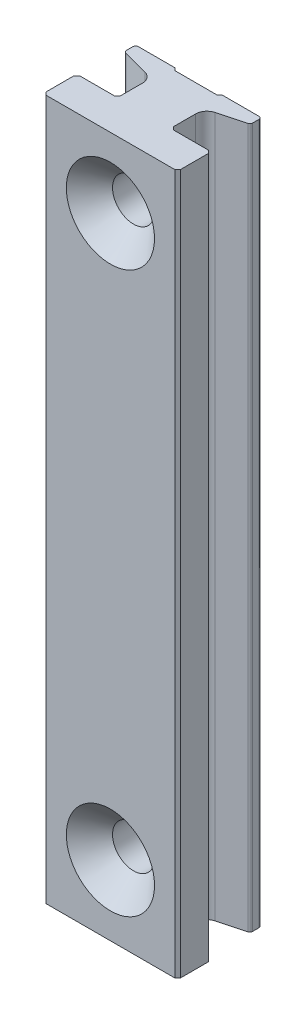
ISO-10303-21;
HEADER;
FILE_DESCRIPTION(('STEP AP214'),'2;1');
FILE_NAME('part.step','',(''),(''),'','','');
FILE_SCHEMA(('AUTOMOTIVE_DESIGN { 1 0 10303 214 1 1 1 1 }'));
ENDSEC;
DATA;
#1=APPLICATION_CONTEXT('core data for automotive mechanical design processes');
#2=APPLICATION_PROTOCOL_DEFINITION('international standard','automotive_design',2000,#1);
#3=PRODUCT_CONTEXT('',#1,'mechanical');
#4=PRODUCT('Part','Part','',(#3));
#5=PRODUCT_RELATED_PRODUCT_CATEGORY('part','',(#4));
#6=PRODUCT_DEFINITION_FORMATION('','',#4);
#7=PRODUCT_DEFINITION_CONTEXT('part definition',#1,'design');
#8=PRODUCT_DEFINITION('design','',#6,#7);
#9=PRODUCT_DEFINITION_SHAPE('','',#8);
#10=(LENGTH_UNIT() NAMED_UNIT(*) SI_UNIT(.MILLI.,.METRE.));
#11=(NAMED_UNIT(*) PLANE_ANGLE_UNIT() SI_UNIT($,.RADIAN.));
#12=(NAMED_UNIT(*) SI_UNIT($,.STERADIAN.) SOLID_ANGLE_UNIT());
#13=UNCERTAINTY_MEASURE_WITH_UNIT(LENGTH_MEASURE(1.E-05),#10,'distance_accuracy_value','');
#14=(GEOMETRIC_REPRESENTATION_CONTEXT(3) GLOBAL_UNCERTAINTY_ASSIGNED_CONTEXT((#13)) GLOBAL_UNIT_ASSIGNED_CONTEXT((#10,
#11,#12)) REPRESENTATION_CONTEXT('',''));
#15=CARTESIAN_POINT('',(0.,0.,0.));
#16=DIRECTION('',(0.,0.,1.));
#17=DIRECTION('',(1.,0.,0.));
#18=AXIS2_PLACEMENT_3D('',#15,#16,#17);
#19=CARTESIAN_POINT('',(0.,0.,0.));
#20=DIRECTION('',(0.,0.,1.));
#21=DIRECTION('',(1.,0.,0.));
#22=AXIS2_PLACEMENT_3D('',#19,#20,#21);
#23=PLANE('',#22);
#24=DIRECTION('',(1.,0.,0.));
#25=VECTOR('',#24,1.);
#26=CARTESIAN_POINT('',(-4.5,-25.,0.));
#27=LINE('',#26,#25);
#28=CARTESIAN_POINT('',(-4.30000000000001,-25.,0.));
#29=VERTEX_POINT('',#28);
#30=CARTESIAN_POINT('',(-1.7,-25.,0.));
#31=VERTEX_POINT('',#30);
#32=EDGE_CURVE('E440',#29,#31,#27,.T.);
#33=ORIENTED_EDGE('',*,*,#32,.F.);
#34=DIRECTION('',(0.,-1.,0.));
#35=VECTOR('',#34,1.);
#36=CARTESIAN_POINT('',(-4.3,25.,0.));
#37=LINE('',#36,#35);
#38=CARTESIAN_POINT('',(-4.3,25.,0.));
#39=VERTEX_POINT('',#38);
#40=EDGE_CURVE('E354',#29,#39,#37,.F.);
#41=ORIENTED_EDGE('',*,*,#40,.T.);
#42=DIRECTION('',(-1.,0.,0.));
#43=VECTOR('',#42,1.);
#44=CARTESIAN_POINT('',(4.5,25.,0.));
#45=LINE('',#44,#43);
#46=CARTESIAN_POINT('',(-1.7,25.,0.));
#47=VERTEX_POINT('',#46);
#48=EDGE_CURVE('E439',#47,#39,#45,.T.);
#49=ORIENTED_EDGE('',*,*,#48,.F.);
#50=DIRECTION('',(0.,1.,0.));
#51=VECTOR('',#50,1.);
#52=CARTESIAN_POINT('',(-1.7,0.,0.));
#53=LINE('',#52,#51);
#54=EDGE_CURVE('E238',#47,#31,#53,.F.);
#55=ORIENTED_EDGE('',*,*,#54,.T.);
#56=EDGE_LOOP('',(#33,#41,#49,#55));
#57=FACE_BOUND('',#56,.T.);
#58=ADVANCED_FACE('F34',(#57),#23,.F.);
#59=CARTESIAN_POINT('',(1.9,-25.,1.49666789853823));
#60=DIRECTION('',(-1.,0.,0.));
#61=DIRECTION('',(0.,0.,1.));
#62=AXIS2_PLACEMENT_3D('',#59,#60,#61);
#63=PLANE('',#62);
#64=DIRECTION('',(0.,0.,1.));
#65=VECTOR('',#64,1.);
#66=CARTESIAN_POINT('',(1.9,-25.,1.49666789853823));
#67=LINE('',#66,#65);
#68=CARTESIAN_POINT('',(1.9,-25.,2.11052948999519));
#69=VERTEX_POINT('',#68);
#70=CARTESIAN_POINT('',(1.9,-25.,3.69999999999999));
#71=VERTEX_POINT('',#70);
#72=EDGE_CURVE('E374',#69,#71,#67,.T.);
#73=ORIENTED_EDGE('',*,*,#72,.F.);
#74=DIRECTION('',(0.,-1.,0.));
#75=VECTOR('',#74,1.);
#76=CARTESIAN_POINT('',(1.9,25.,2.11052948999519));
#77=LINE('',#76,#75);
#78=CARTESIAN_POINT('',(1.9,25.,2.11052948999519));
#79=VERTEX_POINT('',#78);
#80=EDGE_CURVE('E356',#69,#79,#77,.F.);
#81=ORIENTED_EDGE('',*,*,#80,.T.);
#82=DIRECTION('',(0.,0.,1.));
#83=VECTOR('',#82,1.);
#84=CARTESIAN_POINT('',(1.9,25.,1.49666789853823));
#85=LINE('',#84,#83);
#86=CARTESIAN_POINT('',(1.9,25.,3.69999999999999));
#87=VERTEX_POINT('',#86);
#88=EDGE_CURVE('E390',#79,#87,#85,.T.);
#89=ORIENTED_EDGE('',*,*,#88,.T.);
#90=DIRECTION('',(0.,-1.,0.));
#91=VECTOR('',#90,1.);
#92=CARTESIAN_POINT('',(1.9,-25.,3.69999999999999));
#93=LINE('',#92,#91);
#94=EDGE_CURVE('E306',#87,#71,#93,.T.);
#95=ORIENTED_EDGE('',*,*,#94,.T.);
#96=EDGE_LOOP('',(#73,#81,#89,#95));
#97=FACE_BOUND('',#96,.T.);
#98=ADVANCED_FACE('F381',(#97),#63,.F.);
#99=CARTESIAN_POINT('',(-1.9,-25.,6.3));
#100=DIRECTION('',(1.,0.,0.));
#101=DIRECTION('',(0.,0.,-1.));
#102=AXIS2_PLACEMENT_3D('',#99,#100,#101);
#103=PLANE('',#102);
#104=DIRECTION('',(0.,0.,-1.));
#105=VECTOR('',#104,1.);
#106=CARTESIAN_POINT('',(-1.9,25.,6.3));
#107=LINE('',#106,#105);
#108=CARTESIAN_POINT('',(-1.9,25.,3.7));
#109=VERTEX_POINT('',#108);
#110=CARTESIAN_POINT('',(-1.9,25.,2.1105294899952));
#111=VERTEX_POINT('',#110);
#112=EDGE_CURVE('E432',#109,#111,#107,.T.);
#113=ORIENTED_EDGE('',*,*,#112,.T.);
#114=DIRECTION('',(0.,-1.,0.));
#115=VECTOR('',#114,1.);
#116=CARTESIAN_POINT('',(-1.9,-25.,2.1105294899952));
#117=LINE('',#116,#115);
#118=CARTESIAN_POINT('',(-1.9,-25.,2.1105294899952));
#119=VERTEX_POINT('',#118);
#120=EDGE_CURVE('E55',#111,#119,#117,.T.);
#121=ORIENTED_EDGE('',*,*,#120,.T.);
#122=DIRECTION('',(0.,0.,-1.));
#123=VECTOR('',#122,1.);
#124=CARTESIAN_POINT('',(-1.9,-25.,6.3));
#125=LINE('',#124,#123);
#126=CARTESIAN_POINT('',(-1.9,-25.,3.7));
#127=VERTEX_POINT('',#126);
#128=EDGE_CURVE('E433',#127,#119,#125,.T.);
#129=ORIENTED_EDGE('',*,*,#128,.F.);
#130=DIRECTION('',(0.,1.,0.));
#131=VECTOR('',#130,1.);
#132=CARTESIAN_POINT('',(-1.9,25.,3.7));
#133=LINE('',#132,#131);
#134=EDGE_CURVE('E300',#127,#109,#133,.T.);
#135=ORIENTED_EDGE('',*,*,#134,.T.);
#136=EDGE_LOOP('',(#113,#121,#129,#135));
#137=FACE_BOUND('',#136,.T.);
#138=ADVANCED_FACE('F514',(#137),#103,.F.);
#139=CARTESIAN_POINT('',(4.5,-25.,0.));
#140=DIRECTION('',(1.,0.,0.));
#141=DIRECTION('',(0.,1.,0.));
#142=AXIS2_PLACEMENT_3D('',#139,#140,#141);
#143=PLANE('',#142);
#144=DIRECTION('',(0.,0.,1.));
#145=VECTOR('',#144,1.);
#146=CARTESIAN_POINT('',(4.5,25.,0.));
#147=LINE('',#146,#145);
#148=CARTESIAN_POINT('',(4.5,25.,0.199999999999998));
#149=VERTEX_POINT('',#148);
#150=CARTESIAN_POINT('',(4.5,25.,0.646534605004633));
#151=VERTEX_POINT('',#150);
#152=EDGE_CURVE('E442',#149,#151,#147,.T.);
#153=ORIENTED_EDGE('',*,*,#152,.T.);
#154=DIRECTION('',(0.,-1.,0.));
#155=VECTOR('',#154,1.);
#156=CARTESIAN_POINT('',(4.5,-25.,0.646534605004632));
#157=LINE('',#156,#155);
#158=CARTESIAN_POINT('',(4.5,-25.,0.646534605004632));
#159=VERTEX_POINT('',#158);
#160=EDGE_CURVE('E333',#151,#159,#157,.T.);
#161=ORIENTED_EDGE('',*,*,#160,.T.);
#162=DIRECTION('',(0.,0.,1.));
#163=VECTOR('',#162,1.);
#164=CARTESIAN_POINT('',(4.5,-25.,0.));
#165=LINE('',#164,#163);
#166=CARTESIAN_POINT('',(4.5,-25.,0.199999999999998));
#167=VERTEX_POINT('',#166);
#168=EDGE_CURVE('E265',#167,#159,#165,.T.);
#169=ORIENTED_EDGE('',*,*,#168,.F.);
#170=DIRECTION('',(0.,1.,0.));
#171=VECTOR('',#170,1.);
#172=CARTESIAN_POINT('',(4.5,25.,0.199999999999998));
#173=LINE('',#172,#171);
#174=EDGE_CURVE('E330',#167,#149,#173,.T.);
#175=ORIENTED_EDGE('',*,*,#174,.T.);
#176=EDGE_LOOP('',(#153,#161,#169,#175));
#177=FACE_BOUND('',#176,.T.);
#178=ADVANCED_FACE('F493',(#177),#143,.T.);
#179=CARTESIAN_POINT('',(-4.5,-25.,0.));
#180=DIRECTION('',(0.,-1.,0.));
#181=DIRECTION('',(0.,0.,-1.));
#182=AXIS2_PLACEMENT_3D('',#179,#180,#181);
#183=PLANE('',#182);
#184=ORIENTED_EDGE('',*,*,#168,.T.);
#185=CARTESIAN_POINT('',(4.30000000000001,-25.,0.646534605004632));
#186=DIRECTION('',(0.,-1.,0.));
#187=DIRECTION('',(0.,0.,-1.));
#188=AXIS2_PLACEMENT_3D('',#185,#186,#187);
#189=CIRCLE('',#188,0.199999999999999);
#190=CARTESIAN_POINT('',(4.35176380869828,-25.,0.839719770348785));
#191=VERTEX_POINT('',#190);
#192=EDGE_CURVE('E341',#159,#191,#189,.T.);
#193=ORIENTED_EDGE('',*,*,#192,.T.);
#194=DIRECTION('',(0.965925826720774,0.,-0.258819043491374));
#195=VECTOR('',#194,1.);
#196=CARTESIAN_POINT('',(1.9,-25.,1.49666789853823));
#197=LINE('',#196,#195);
#198=CARTESIAN_POINT('',(2.49294476522019,-25.,1.33778882860125));
#199=VERTEX_POINT('',#198);
#200=EDGE_CURVE('E376',#191,#199,#197,.F.);
#201=ORIENTED_EDGE('',*,*,#200,.T.);
#202=CARTESIAN_POINT('',(2.70000000001793,-25.,2.11052948999519));
#203=DIRECTION('',(0.,-1.,0.));
#204=DIRECTION('',(0.,0.,-1.));
#205=AXIS2_PLACEMENT_3D('',#202,#203,#204);
#206=CIRCLE('',#205,0.800000000017933);
#207=EDGE_CURVE('E367',#199,#69,#206,.F.);
#208=ORIENTED_EDGE('',*,*,#207,.T.);
#209=ORIENTED_EDGE('',*,*,#72,.T.);
#210=DIRECTION('',(-0.70710678118656,0.,-0.707106781186535));
#211=VECTOR('',#210,1.);
#212=CARTESIAN_POINT('',(2.10000000000002,-25.,3.9));
#213=LINE('',#212,#211);
#214=CARTESIAN_POINT('',(2.10000000000001,-25.,3.89999999999999));
#215=VERTEX_POINT('',#214);
#216=EDGE_CURVE('E316',#71,#215,#213,.F.);
#217=ORIENTED_EDGE('',*,*,#216,.T.);
#218=DIRECTION('',(-1.,0.,0.));
#219=VECTOR('',#218,1.);
#220=CARTESIAN_POINT('',(4.8,-25.,3.89999999999999));
#221=LINE('',#220,#219);
#222=CARTESIAN_POINT('',(4.60000000000001,-25.,3.9));
#223=VERTEX_POINT('',#222);
#224=EDGE_CURVE('E398',#223,#215,#221,.T.);
#225=ORIENTED_EDGE('',*,*,#224,.F.);
#226=DIRECTION('',(-0.707106781186548,0.,-0.707106781186548));
#227=VECTOR('',#226,1.);
#228=CARTESIAN_POINT('',(-1.9,-25.,-2.60000000000001));
#229=LINE('',#228,#227);
#230=CARTESIAN_POINT('',(4.8,-25.,4.09999999999999));
#231=VERTEX_POINT('',#230);
#232=EDGE_CURVE('E287',#223,#231,#229,.F.);
#233=ORIENTED_EDGE('',*,*,#232,.T.);
#234=DIRECTION('',(0.,0.,-1.));
#235=VECTOR('',#234,1.);
#236=CARTESIAN_POINT('',(4.8,-25.,3.89999999999999));
#237=LINE('',#236,#235);
#238=CARTESIAN_POINT('',(4.8,-25.,6.1));
#239=VERTEX_POINT('',#238);
#240=EDGE_CURVE('E416',#239,#231,#237,.T.);
#241=ORIENTED_EDGE('',*,*,#240,.F.);
#242=DIRECTION('',(-0.707106781186548,0.,0.707106781186548));
#243=VECTOR('',#242,1.);
#244=CARTESIAN_POINT('',(3.2,-25.,7.7));
#245=LINE('',#244,#243);
#246=CARTESIAN_POINT('',(4.6,-25.,6.3));
#247=VERTEX_POINT('',#246);
#248=EDGE_CURVE('E281',#239,#247,#245,.T.);
#249=ORIENTED_EDGE('',*,*,#248,.T.);
#250=DIRECTION('',(1.,0.,0.));
#251=VECTOR('',#250,1.);
#252=CARTESIAN_POINT('',(-4.5,-25.,6.3));
#253=LINE('',#252,#251);
#254=CARTESIAN_POINT('',(-4.6,-25.,6.3));
#255=VERTEX_POINT('',#254);
#256=EDGE_CURVE('E446',#255,#247,#253,.T.);
#257=ORIENTED_EDGE('',*,*,#256,.F.);
#258=DIRECTION('',(-0.707106781186548,0.,-0.707106781186548));
#259=VECTOR('',#258,1.);
#260=CARTESIAN_POINT('',(-7.7,-25.,3.2));
#261=LINE('',#260,#259);
#262=CARTESIAN_POINT('',(-4.8,-25.,6.1));
#263=VERTEX_POINT('',#262);
#264=EDGE_CURVE('E283',#255,#263,#261,.T.);
#265=ORIENTED_EDGE('',*,*,#264,.T.);
#266=DIRECTION('',(0.,0.,1.));
#267=VECTOR('',#266,1.);
#268=CARTESIAN_POINT('',(-4.8,-25.,6.30000000000001));
#269=LINE('',#268,#267);
#270=CARTESIAN_POINT('',(-4.8,-25.,4.09999999999999));
#271=VERTEX_POINT('',#270);
#272=EDGE_CURVE('E423',#271,#263,#269,.T.);
#273=ORIENTED_EDGE('',*,*,#272,.F.);
#274=DIRECTION('',(-0.707106781186547,0.,0.707106781186548));
#275=VECTOR('',#274,1.);
#276=CARTESIAN_POINT('',(-2.60000000000001,-25.,1.89999999999999));
#277=LINE('',#276,#275);
#278=CARTESIAN_POINT('',(-4.60000000000001,-25.,3.9));
#279=VERTEX_POINT('',#278);
#280=EDGE_CURVE('E285',#271,#279,#277,.F.);
#281=ORIENTED_EDGE('',*,*,#280,.T.);
#282=DIRECTION('',(1.,0.,0.));
#283=VECTOR('',#282,1.);
#284=CARTESIAN_POINT('',(-4.8,-25.,3.9));
#285=LINE('',#284,#283);
#286=CARTESIAN_POINT('',(-2.10000000000001,-25.,3.9));
#287=VERTEX_POINT('',#286);
#288=EDGE_CURVE('E426',#279,#287,#285,.T.);
#289=ORIENTED_EDGE('',*,*,#288,.T.);
#290=DIRECTION('',(-0.70710678118656,0.,0.707106781186535));
#291=VECTOR('',#290,1.);
#292=CARTESIAN_POINT('',(-2.10000000000001,-25.,3.9));
#293=LINE('',#292,#291);
#294=EDGE_CURVE('E309',#287,#127,#293,.F.);
#295=ORIENTED_EDGE('',*,*,#294,.T.);
#296=ORIENTED_EDGE('',*,*,#128,.T.);
#297=CARTESIAN_POINT('',(-2.70000000001793,-25.,2.1105294899952));
#298=DIRECTION('',(0.,-1.,0.));
#299=DIRECTION('',(0.,0.,-1.));
#300=AXIS2_PLACEMENT_3D('',#297,#298,#299);
#301=CIRCLE('',#300,0.800000000017933);
#302=CARTESIAN_POINT('',(-2.49294476522019,-25.,1.33778882860126));
#303=VERTEX_POINT('',#302);
#304=EDGE_CURVE('E11',#119,#303,#301,.F.);
#305=ORIENTED_EDGE('',*,*,#304,.T.);
#306=DIRECTION('',(0.965925826720774,0.,0.258819043491374));
#307=VECTOR('',#306,1.);
#308=CARTESIAN_POINT('',(-4.5,-25.,0.800000002865442));
#309=LINE('',#308,#307);
#310=CARTESIAN_POINT('',(-4.35176380869828,-25.,0.839719770348796));
#311=VERTEX_POINT('',#310);
#312=EDGE_CURVE('E402',#303,#311,#309,.F.);
#313=ORIENTED_EDGE('',*,*,#312,.T.);
#314=CARTESIAN_POINT('',(-4.30000000000001,-25.,0.646534605004642));
#315=DIRECTION('',(0.,-1.,0.));
#316=DIRECTION('',(0.,0.,-1.));
#317=AXIS2_PLACEMENT_3D('',#314,#315,#316);
#318=CIRCLE('',#317,0.199999999999999);
#319=CARTESIAN_POINT('',(-4.5,-25.,0.646534605004642));
#320=VERTEX_POINT('',#319);
#321=EDGE_CURVE('E337',#311,#320,#318,.T.);
#322=ORIENTED_EDGE('',*,*,#321,.T.);
#323=DIRECTION('',(0.,0.,1.));
#324=VECTOR('',#323,1.);
#325=CARTESIAN_POINT('',(-4.5,-25.,0.));
#326=LINE('',#325,#324);
#327=CARTESIAN_POINT('',(-4.5,-25.,0.199999999999998));
#328=VERTEX_POINT('',#327);
#329=EDGE_CURVE('E450',#328,#320,#326,.T.);
#330=ORIENTED_EDGE('',*,*,#329,.F.);
#331=CARTESIAN_POINT('',(-4.30000000000001,-25.,0.199999999999998));
#332=DIRECTION('',(0.,-1.,0.));
#333=DIRECTION('',(0.,0.,-1.));
#334=AXIS2_PLACEMENT_3D('',#331,#332,#333);
#335=CIRCLE('',#334,0.199999999999999);
#336=EDGE_CURVE('E335',#328,#29,#335,.T.);
#337=ORIENTED_EDGE('',*,*,#336,.T.);
#338=ORIENTED_EDGE('',*,*,#32,.T.);
#339=DIRECTION('',(0.707106781186549,0.,0.707106781186546));
#340=VECTOR('',#339,1.);
#341=CARTESIAN_POINT('',(-3.10000000000001,-25.,-1.4));
#342=LINE('',#341,#340);
#343=CARTESIAN_POINT('',(-1.52,-25.,0.18));
#344=VERTEX_POINT('',#343);
#345=EDGE_CURVE('E254',#344,#31,#342,.F.);
#346=ORIENTED_EDGE('',*,*,#345,.F.);
#347=DIRECTION('',(-1.,0.,0.));
#348=VECTOR('',#347,1.);
#349=CARTESIAN_POINT('',(1.52,-25.,0.18));
#350=LINE('',#349,#348);
#351=CARTESIAN_POINT('',(1.52,-25.,0.18));
#352=VERTEX_POINT('',#351);
#353=EDGE_CURVE('E246',#352,#344,#350,.T.);
#354=ORIENTED_EDGE('',*,*,#353,.F.);
#355=DIRECTION('',(0.707106781186549,0.,-0.707106781186546));
#356=VECTOR('',#355,1.);
#357=CARTESIAN_POINT('',(-1.40000000000002,-25.,3.1));
#358=LINE('',#357,#356);
#359=CARTESIAN_POINT('',(1.7,-25.,0.));
#360=VERTEX_POINT('',#359);
#361=EDGE_CURVE('E226',#360,#352,#358,.F.);
#362=ORIENTED_EDGE('',*,*,#361,.F.);
#363=CARTESIAN_POINT('',(4.30000000000001,-25.,0.));
#364=VERTEX_POINT('',#363);
#365=EDGE_CURVE('E438',#360,#364,#27,.T.);
#366=ORIENTED_EDGE('',*,*,#365,.T.);
#367=CARTESIAN_POINT('',(4.30000000000001,-25.,0.199999999999998));
#368=DIRECTION('',(0.,-1.,0.));
#369=DIRECTION('',(0.,0.,-1.));
#370=AXIS2_PLACEMENT_3D('',#367,#368,#369);
#371=CIRCLE('',#370,0.199999999999999);
#372=EDGE_CURVE('E339',#364,#167,#371,.T.);
#373=ORIENTED_EDGE('',*,*,#372,.T.);
#374=EDGE_LOOP('',(#184,#193,#201,#208,#209,#217,#225,#233,#241,#249,#257,#265,#273,#281,#289,
#295,#296,#305,#313,#322,#330,#337,#338,#346,#354,#362,#366,#373));
#375=FACE_BOUND('',#374,.T.);
#376=ADVANCED_FACE('F373',(#375),#183,.T.);
#377=CARTESIAN_POINT('',(-4.5,25.,0.));
#378=DIRECTION('',(-1.,0.,0.));
#379=DIRECTION('',(0.,-1.,0.));
#380=AXIS2_PLACEMENT_3D('',#377,#378,#379);
#381=PLANE('',#380);
#382=ORIENTED_EDGE('',*,*,#329,.T.);
#383=DIRECTION('',(0.,-1.,0.));
#384=VECTOR('',#383,1.);
#385=CARTESIAN_POINT('',(-4.5,25.,0.646534605004643));
#386=LINE('',#385,#384);
#387=CARTESIAN_POINT('',(-4.5,25.,0.646534605004643));
#388=VERTEX_POINT('',#387);
#389=EDGE_CURVE('E348',#320,#388,#386,.F.);
#390=ORIENTED_EDGE('',*,*,#389,.T.);
#391=DIRECTION('',(0.,0.,1.));
#392=VECTOR('',#391,1.);
#393=CARTESIAN_POINT('',(-4.5,25.,0.));
#394=LINE('',#393,#392);
#395=CARTESIAN_POINT('',(-4.5,25.,0.199999999999998));
#396=VERTEX_POINT('',#395);
#397=EDGE_CURVE('E453',#396,#388,#394,.T.);
#398=ORIENTED_EDGE('',*,*,#397,.F.);
#399=DIRECTION('',(0.,-1.,0.));
#400=VECTOR('',#399,1.);
#401=CARTESIAN_POINT('',(-4.5,-25.,0.199999999999998));
#402=LINE('',#401,#400);
#403=EDGE_CURVE('E345',#396,#328,#402,.T.);
#404=ORIENTED_EDGE('',*,*,#403,.T.);
#405=EDGE_LOOP('',(#382,#390,#398,#404));
#406=FACE_BOUND('',#405,.T.);
#407=ADVANCED_FACE('F469',(#406),#381,.T.);
#408=CARTESIAN_POINT('',(4.5,25.,0.));
#409=DIRECTION('',(0.,1.,0.));
#410=DIRECTION('',(0.,0.,1.));
#411=AXIS2_PLACEMENT_3D('',#408,#409,#410);
#412=PLANE('',#411);
#413=DIRECTION('',(0.965925826720774,0.,-0.258819043491374));
#414=VECTOR('',#413,1.);
#415=CARTESIAN_POINT('',(4.69999999956075,25.,0.746410164854452));
#416=LINE('',#415,#414);
#417=CARTESIAN_POINT('',(4.35176380869828,25.,0.839719770348786));
#418=VERTEX_POINT('',#417);
#419=CARTESIAN_POINT('',(2.49294476522019,25.,1.33778882860125));
#420=VERTEX_POINT('',#419);
#421=EDGE_CURVE('E389',#418,#420,#416,.F.);
#422=ORIENTED_EDGE('',*,*,#421,.F.);
#423=CARTESIAN_POINT('',(4.3,25.,0.646534605004633));
#424=DIRECTION('',(0.,1.,0.));
#425=DIRECTION('',(0.,0.,1.));
#426=AXIS2_PLACEMENT_3D('',#423,#424,#425);
#427=CIRCLE('',#426,0.199999999999999);
#428=EDGE_CURVE('E328',#418,#151,#427,.T.);
#429=ORIENTED_EDGE('',*,*,#428,.T.);
#430=ORIENTED_EDGE('',*,*,#152,.F.);
#431=CARTESIAN_POINT('',(4.3,25.,0.199999999999998));
#432=DIRECTION('',(0.,1.,0.));
#433=DIRECTION('',(0.,0.,1.));
#434=AXIS2_PLACEMENT_3D('',#431,#432,#433);
#435=CIRCLE('',#434,0.199999999999999);
#436=CARTESIAN_POINT('',(4.3,25.,0.));
#437=VERTEX_POINT('',#436);
#438=EDGE_CURVE('E326',#149,#437,#435,.T.);
#439=ORIENTED_EDGE('',*,*,#438,.T.);
#440=CARTESIAN_POINT('',(1.7,25.,0.));
#441=VERTEX_POINT('',#440);
#442=EDGE_CURVE('E243',#437,#441,#45,.T.);
#443=ORIENTED_EDGE('',*,*,#442,.T.);
#444=DIRECTION('',(0.707106781186549,0.,-0.707106781186546));
#445=VECTOR('',#444,1.);
#446=CARTESIAN_POINT('',(1.52,25.,0.18));
#447=LINE('',#446,#445);
#448=CARTESIAN_POINT('',(1.52,25.,0.18));
#449=VERTEX_POINT('',#448);
#450=EDGE_CURVE('E223',#441,#449,#447,.F.);
#451=ORIENTED_EDGE('',*,*,#450,.T.);
#452=DIRECTION('',(-1.,0.,0.));
#453=VECTOR('',#452,1.);
#454=CARTESIAN_POINT('',(1.52,25.,0.18));
#455=LINE('',#454,#453);
#456=CARTESIAN_POINT('',(-1.52,25.,0.18));
#457=VERTEX_POINT('',#456);
#458=EDGE_CURVE('E234',#449,#457,#455,.T.);
#459=ORIENTED_EDGE('',*,*,#458,.T.);
#460=DIRECTION('',(0.707106781186549,0.,0.707106781186546));
#461=VECTOR('',#460,1.);
#462=CARTESIAN_POINT('',(-1.52,25.,0.18));
#463=LINE('',#462,#461);
#464=EDGE_CURVE('E244',#457,#47,#463,.F.);
#465=ORIENTED_EDGE('',*,*,#464,.T.);
#466=ORIENTED_EDGE('',*,*,#48,.T.);
#467=CARTESIAN_POINT('',(-4.3,25.,0.199999999999998));
#468=DIRECTION('',(0.,1.,0.));
#469=DIRECTION('',(0.,0.,1.));
#470=AXIS2_PLACEMENT_3D('',#467,#468,#469);
#471=CIRCLE('',#470,0.199999999999999);
#472=EDGE_CURVE('E321',#39,#396,#471,.T.);
#473=ORIENTED_EDGE('',*,*,#472,.T.);
#474=ORIENTED_EDGE('',*,*,#397,.T.);
#475=CARTESIAN_POINT('',(-4.3,25.,0.646534605004643));
#476=DIRECTION('',(0.,1.,0.));
#477=DIRECTION('',(0.,0.,1.));
#478=AXIS2_PLACEMENT_3D('',#475,#476,#477);
#479=CIRCLE('',#478,0.199999999999999);
#480=CARTESIAN_POINT('',(-4.35176380869828,25.,0.839719770348797));
#481=VERTEX_POINT('',#480);
#482=EDGE_CURVE('E323',#388,#481,#479,.T.);
#483=ORIENTED_EDGE('',*,*,#482,.T.);
#484=DIRECTION('',(0.965925826720774,0.,0.258819043491374));
#485=VECTOR('',#484,1.);
#486=CARTESIAN_POINT('',(3.69711432497514,25.,2.99641015185383));
#487=LINE('',#486,#485);
#488=CARTESIAN_POINT('',(-2.49294476522019,25.,1.33778882860126));
#489=VERTEX_POINT('',#488);
#490=EDGE_CURVE('E435',#489,#481,#487,.F.);
#491=ORIENTED_EDGE('',*,*,#490,.F.);
#492=CARTESIAN_POINT('',(-2.70000000001793,25.,2.1105294899952));
#493=DIRECTION('',(0.,1.,0.));
#494=DIRECTION('',(0.,0.,1.));
#495=AXIS2_PLACEMENT_3D('',#492,#493,#494);
#496=CIRCLE('',#495,0.800000000017933);
#497=EDGE_CURVE('E42',#489,#111,#496,.F.);
#498=ORIENTED_EDGE('',*,*,#497,.T.);
#499=ORIENTED_EDGE('',*,*,#112,.F.);
#500=DIRECTION('',(0.70710678118656,0.,-0.707106781186535));
#501=VECTOR('',#500,1.);
#502=CARTESIAN_POINT('',(-2.10000000000001,25.,3.9));
#503=LINE('',#502,#501);
#504=CARTESIAN_POINT('',(-2.10000000000001,25.,3.9));
#505=VERTEX_POINT('',#504);
#506=EDGE_CURVE('E311',#109,#505,#503,.F.);
#507=ORIENTED_EDGE('',*,*,#506,.T.);
#508=DIRECTION('',(1.,0.,0.));
#509=VECTOR('',#508,1.);
#510=CARTESIAN_POINT('',(-4.8,25.,3.9));
#511=LINE('',#510,#509);
#512=CARTESIAN_POINT('',(-4.60000000000001,25.,3.9));
#513=VERTEX_POINT('',#512);
#514=EDGE_CURVE('E429',#513,#505,#511,.T.);
#515=ORIENTED_EDGE('',*,*,#514,.F.);
#516=DIRECTION('',(0.707106781186547,0.,-0.707106781186548));
#517=VECTOR('',#516,1.);
#518=CARTESIAN_POINT('',(1.89999999999999,25.,-2.60000000000001));
#519=LINE('',#518,#517);
#520=CARTESIAN_POINT('',(-4.8,25.,4.09999999999999));
#521=VERTEX_POINT('',#520);
#522=EDGE_CURVE('E272',#513,#521,#519,.F.);
#523=ORIENTED_EDGE('',*,*,#522,.T.);
#524=DIRECTION('',(0.,0.,-1.));
#525=VECTOR('',#524,1.);
#526=CARTESIAN_POINT('',(-4.8,25.,3.9));
#527=LINE('',#526,#525);
#528=CARTESIAN_POINT('',(-4.8,25.,6.1));
#529=VERTEX_POINT('',#528);
#530=EDGE_CURVE('E385',#529,#521,#527,.T.);
#531=ORIENTED_EDGE('',*,*,#530,.F.);
#532=DIRECTION('',(0.707106781186548,0.,0.707106781186548));
#533=VECTOR('',#532,1.);
#534=CARTESIAN_POINT('',(-3.2,25.,7.7));
#535=LINE('',#534,#533);
#536=CARTESIAN_POINT('',(-4.6,25.,6.3));
#537=VERTEX_POINT('',#536);
#538=EDGE_CURVE('E270',#529,#537,#535,.T.);
#539=ORIENTED_EDGE('',*,*,#538,.T.);
#540=DIRECTION('',(-1.,0.,0.));
#541=VECTOR('',#540,1.);
#542=CARTESIAN_POINT('',(4.5,25.,6.3));
#543=LINE('',#542,#541);
#544=CARTESIAN_POINT('',(4.6,25.,6.3));
#545=VERTEX_POINT('',#544);
#546=EDGE_CURVE('E443',#545,#537,#543,.T.);
#547=ORIENTED_EDGE('',*,*,#546,.F.);
#548=DIRECTION('',(0.707106781186548,0.,-0.707106781186548));
#549=VECTOR('',#548,1.);
#550=CARTESIAN_POINT('',(7.7,25.,3.2));
#551=LINE('',#550,#549);
#552=CARTESIAN_POINT('',(4.8,25.,6.1));
#553=VERTEX_POINT('',#552);
#554=EDGE_CURVE('E268',#545,#553,#551,.T.);
#555=ORIENTED_EDGE('',*,*,#554,.T.);
#556=DIRECTION('',(0.,0.,1.));
#557=VECTOR('',#556,1.);
#558=CARTESIAN_POINT('',(4.8,25.,6.3));
#559=LINE('',#558,#557);
#560=CARTESIAN_POINT('',(4.8,25.,4.09999999999999));
#561=VERTEX_POINT('',#560);
#562=EDGE_CURVE('E412',#561,#553,#559,.T.);
#563=ORIENTED_EDGE('',*,*,#562,.F.);
#564=DIRECTION('',(0.707106781186548,0.,0.707106781186548));
#565=VECTOR('',#564,1.);
#566=CARTESIAN_POINT('',(2.6,25.,1.9));
#567=LINE('',#566,#565);
#568=CARTESIAN_POINT('',(4.60000000000001,25.,3.9));
#569=VERTEX_POINT('',#568);
#570=EDGE_CURVE('E274',#561,#569,#567,.F.);
#571=ORIENTED_EDGE('',*,*,#570,.T.);
#572=DIRECTION('',(-1.,0.,0.));
#573=VECTOR('',#572,1.);
#574=CARTESIAN_POINT('',(4.8,25.,3.9));
#575=LINE('',#574,#573);
#576=CARTESIAN_POINT('',(2.10000000000001,25.,3.9));
#577=VERTEX_POINT('',#576);
#578=EDGE_CURVE('E394',#569,#577,#575,.T.);
#579=ORIENTED_EDGE('',*,*,#578,.T.);
#580=DIRECTION('',(0.70710678118656,0.,0.707106781186535));
#581=VECTOR('',#580,1.);
#582=CARTESIAN_POINT('',(2.10000000000001,25.,3.9));
#583=LINE('',#582,#581);
#584=EDGE_CURVE('E313',#577,#87,#583,.F.);
#585=ORIENTED_EDGE('',*,*,#584,.T.);
#586=ORIENTED_EDGE('',*,*,#88,.F.);
#587=CARTESIAN_POINT('',(2.70000000001793,25.,2.11052948999519));
#588=DIRECTION('',(0.,1.,0.));
#589=DIRECTION('',(0.,0.,1.));
#590=AXIS2_PLACEMENT_3D('',#587,#588,#589);
#591=CIRCLE('',#590,0.800000000017933);
#592=EDGE_CURVE('E365',#79,#420,#591,.F.);
#593=ORIENTED_EDGE('',*,*,#592,.T.);
#594=EDGE_LOOP('',(#422,#429,#430,#439,#443,#451,#459,#465,#466,#473,#474,#483,#491,#498,#499,
#507,#515,#523,#531,#539,#547,#555,#563,#571,#579,#585,#586,#593));
#595=FACE_BOUND('',#594,.T.);
#596=ADVANCED_FACE('F241',(#595),#412,.T.);
#597=ORIENTED_EDGE('',*,*,#442,.F.);
#598=DIRECTION('',(0.,1.,0.));
#599=VECTOR('',#598,1.);
#600=CARTESIAN_POINT('',(4.30000000000001,-25.,0.));
#601=LINE('',#600,#599);
#602=EDGE_CURVE('E343',#437,#364,#601,.F.);
#603=ORIENTED_EDGE('',*,*,#602,.T.);
#604=ORIENTED_EDGE('',*,*,#365,.F.);
#605=DIRECTION('',(0.,1.,0.));
#606=VECTOR('',#605,1.);
#607=CARTESIAN_POINT('',(1.7,25.,0.));
#608=LINE('',#607,#606);
#609=EDGE_CURVE('E231',#441,#360,#608,.F.);
#610=ORIENTED_EDGE('',*,*,#609,.F.);
#611=EDGE_LOOP('',(#597,#603,#604,#610));
#612=FACE_BOUND('',#611,.T.);
#613=ADVANCED_FACE('F485',(#612),#23,.F.);
#614=CARTESIAN_POINT('',(0.,0.,6.3));
#615=DIRECTION('',(0.,0.,1.));
#616=DIRECTION('',(1.,0.,0.));
#617=AXIS2_PLACEMENT_3D('',#614,#615,#616);
#618=PLANE('',#617);
#619=CARTESIAN_POINT('',(0.,20.,6.3));
#620=DIRECTION('',(0.,0.,1.));
#621=DIRECTION('',(1.,0.,0.));
#622=AXIS2_PLACEMENT_3D('',#619,#620,#621);
#623=CIRCLE('',#622,3.15);
#624=CARTESIAN_POINT('',(3.15000000000001,20.,6.3));
#625=VERTEX_POINT('',#624);
#626=EDGE_CURVE('E851',#625,#625,#623,.T.);
#627=ORIENTED_EDGE('',*,*,#626,.F.);
#628=EDGE_LOOP('',(#627));
#629=FACE_BOUND('',#628,.T.);
#630=CARTESIAN_POINT('',(0.,-20.,6.3));
#631=DIRECTION('',(0.,0.,1.));
#632=DIRECTION('',(1.,0.,0.));
#633=AXIS2_PLACEMENT_3D('',#630,#631,#632);
#634=CIRCLE('',#633,3.15);
#635=CARTESIAN_POINT('',(3.15000000000001,-20.,6.3));
#636=VERTEX_POINT('',#635);
#637=EDGE_CURVE('E259',#636,#636,#634,.T.);
#638=ORIENTED_EDGE('',*,*,#637,.F.);
#639=EDGE_LOOP('',(#638));
#640=FACE_BOUND('',#639,.T.);
#641=ORIENTED_EDGE('',*,*,#546,.T.);
#642=DIRECTION('',(0.,-1.,0.));
#643=VECTOR('',#642,1.);
#644=CARTESIAN_POINT('',(-4.6,-25.,6.3));
#645=LINE('',#644,#643);
#646=EDGE_CURVE('E304',#537,#255,#645,.T.);
#647=ORIENTED_EDGE('',*,*,#646,.T.);
#648=ORIENTED_EDGE('',*,*,#256,.T.);
#649=DIRECTION('',(0.,1.,0.));
#650=VECTOR('',#649,1.);
#651=CARTESIAN_POINT('',(4.6,25.,6.3));
#652=LINE('',#651,#650);
#653=EDGE_CURVE('E302',#247,#545,#652,.T.);
#654=ORIENTED_EDGE('',*,*,#653,.T.);
#655=EDGE_LOOP('',(#641,#647,#648,#654));
#656=FACE_BOUND('',#655,.T.);
#657=ADVANCED_FACE('F519',(#629,#640,#656),#618,.T.);
#658=CARTESIAN_POINT('',(-4.5,-25.,0.800000002865442));
#659=DIRECTION('',(-0.258819043491374,0.,0.965925826720774));
#660=DIRECTION('',(0.965925826720774,0.,0.258819043491374));
#661=AXIS2_PLACEMENT_3D('',#658,#659,#660);
#662=PLANE('',#661);
#663=ORIENTED_EDGE('',*,*,#312,.F.);
#664=DIRECTION('',(0.,1.,0.));
#665=VECTOR('',#664,1.);
#666=CARTESIAN_POINT('',(-2.49294476522019,25.,1.33778882860126));
#667=LINE('',#666,#665);
#668=EDGE_CURVE('E361',#303,#489,#667,.T.);
#669=ORIENTED_EDGE('',*,*,#668,.T.);
#670=ORIENTED_EDGE('',*,*,#490,.T.);
#671=DIRECTION('',(0.,1.,0.));
#672=VECTOR('',#671,1.);
#673=CARTESIAN_POINT('',(-4.35176380869828,-25.,0.839719770348796));
#674=LINE('',#673,#672);
#675=EDGE_CURVE('E351',#481,#311,#674,.F.);
#676=ORIENTED_EDGE('',*,*,#675,.T.);
#677=EDGE_LOOP('',(#663,#669,#670,#676));
#678=FACE_BOUND('',#677,.T.);
#679=ADVANCED_FACE('F459',(#678),#662,.T.);
#680=CARTESIAN_POINT('',(-4.8,-25.,3.9));
#681=DIRECTION('',(0.,0.,1.));
#682=DIRECTION('',(1.,0.,0.));
#683=AXIS2_PLACEMENT_3D('',#680,#681,#682);
#684=PLANE('',#683);
#685=ORIENTED_EDGE('',*,*,#288,.F.);
#686=DIRECTION('',(0.,1.,0.));
#687=VECTOR('',#686,1.);
#688=CARTESIAN_POINT('',(-4.60000000000001,-25.,3.9));
#689=LINE('',#688,#687);
#690=EDGE_CURVE('E298',#279,#513,#689,.T.);
#691=ORIENTED_EDGE('',*,*,#690,.T.);
#692=ORIENTED_EDGE('',*,*,#514,.T.);
#693=DIRECTION('',(0.,-1.,0.));
#694=VECTOR('',#693,1.);
#695=CARTESIAN_POINT('',(-2.10000000000001,-25.,3.9));
#696=LINE('',#695,#694);
#697=EDGE_CURVE('E295',#505,#287,#696,.T.);
#698=ORIENTED_EDGE('',*,*,#697,.T.);
#699=EDGE_LOOP('',(#685,#691,#692,#698));
#700=FACE_BOUND('',#699,.T.);
#701=ADVANCED_FACE('F536',(#700),#684,.F.);
#702=CARTESIAN_POINT('',(-4.8,0.,0.));
#703=DIRECTION('',(1.,0.,0.));
#704=DIRECTION('',(0.,0.,-1.));
#705=AXIS2_PLACEMENT_3D('',#702,#703,#704);
#706=PLANE('',#705);
#707=ORIENTED_EDGE('',*,*,#530,.T.);
#708=DIRECTION('',(0.,-1.,0.));
#709=VECTOR('',#708,1.);
#710=CARTESIAN_POINT('',(-4.8,0.,4.09999999999999));
#711=LINE('',#710,#709);
#712=EDGE_CURVE('E292',#521,#271,#711,.T.);
#713=ORIENTED_EDGE('',*,*,#712,.T.);
#714=ORIENTED_EDGE('',*,*,#272,.T.);
#715=DIRECTION('',(0.,1.,0.));
#716=VECTOR('',#715,1.);
#717=CARTESIAN_POINT('',(-4.8,25.,6.1));
#718=LINE('',#717,#716);
#719=EDGE_CURVE('E289',#263,#529,#718,.T.);
#720=ORIENTED_EDGE('',*,*,#719,.T.);
#721=EDGE_LOOP('',(#707,#713,#714,#720));
#722=FACE_BOUND('',#721,.T.);
#723=ADVANCED_FACE('F540',(#722),#706,.F.);
#724=CARTESIAN_POINT('',(1.9,-25.,1.49666789853823));
#725=DIRECTION('',(0.258819043491374,0.,0.965925826720774));
#726=DIRECTION('',(0.965925826720774,0.,-0.258819043491374));
#727=AXIS2_PLACEMENT_3D('',#724,#725,#726);
#728=PLANE('',#727);
#729=ORIENTED_EDGE('',*,*,#421,.T.);
#730=DIRECTION('',(0.,1.,0.));
#731=VECTOR('',#730,1.);
#732=CARTESIAN_POINT('',(2.49294476522019,-25.,1.33778882860125));
#733=LINE('',#732,#731);
#734=EDGE_CURVE('E359',#420,#199,#733,.F.);
#735=ORIENTED_EDGE('',*,*,#734,.T.);
#736=ORIENTED_EDGE('',*,*,#200,.F.);
#737=DIRECTION('',(0.,1.,0.));
#738=VECTOR('',#737,1.);
#739=CARTESIAN_POINT('',(4.35176380869828,25.,0.839719770348786));
#740=LINE('',#739,#738);
#741=EDGE_CURVE('E318',#191,#418,#740,.T.);
#742=ORIENTED_EDGE('',*,*,#741,.T.);
#743=EDGE_LOOP('',(#729,#735,#736,#742));
#744=FACE_BOUND('',#743,.T.);
#745=ADVANCED_FACE('F392',(#744),#728,.T.);
#746=CARTESIAN_POINT('',(4.8,25.,3.9));
#747=DIRECTION('',(0.,0.,1.));
#748=DIRECTION('',(0.,-1.,0.));
#749=AXIS2_PLACEMENT_3D('',#746,#747,#748);
#750=PLANE('',#749);
#751=ORIENTED_EDGE('',*,*,#578,.F.);
#752=DIRECTION('',(0.,-1.,0.));
#753=VECTOR('',#752,1.);
#754=CARTESIAN_POINT('',(4.60000000000001,25.,3.9));
#755=LINE('',#754,#753);
#756=EDGE_CURVE('E279',#569,#223,#755,.T.);
#757=ORIENTED_EDGE('',*,*,#756,.T.);
#758=ORIENTED_EDGE('',*,*,#224,.T.);
#759=DIRECTION('',(0.,1.,0.));
#760=VECTOR('',#759,1.);
#761=CARTESIAN_POINT('',(2.10000000000001,25.,3.9));
#762=LINE('',#761,#760);
#763=EDGE_CURVE('E276',#215,#577,#762,.T.);
#764=ORIENTED_EDGE('',*,*,#763,.T.);
#765=EDGE_LOOP('',(#751,#757,#758,#764));
#766=FACE_BOUND('',#765,.T.);
#767=ADVANCED_FACE('F539',(#766),#750,.F.);
#768=CARTESIAN_POINT('',(4.8,0.,0.));
#769=DIRECTION('',(-1.,0.,0.));
#770=DIRECTION('',(0.,0.,1.));
#771=AXIS2_PLACEMENT_3D('',#768,#769,#770);
#772=PLANE('',#771);
#773=ORIENTED_EDGE('',*,*,#240,.T.);
#774=DIRECTION('',(0.,1.,0.));
#775=VECTOR('',#774,1.);
#776=CARTESIAN_POINT('',(4.8,0.,4.09999999999999));
#777=LINE('',#776,#775);
#778=EDGE_CURVE('E264',#231,#561,#777,.T.);
#779=ORIENTED_EDGE('',*,*,#778,.T.);
#780=ORIENTED_EDGE('',*,*,#562,.T.);
#781=DIRECTION('',(0.,-1.,0.));
#782=VECTOR('',#781,1.);
#783=CARTESIAN_POINT('',(4.8,-25.,6.1));
#784=LINE('',#783,#782);
#785=EDGE_CURVE('E261',#553,#239,#784,.T.);
#786=ORIENTED_EDGE('',*,*,#785,.T.);
#787=EDGE_LOOP('',(#773,#779,#780,#786));
#788=FACE_BOUND('',#787,.T.);
#789=ADVANCED_FACE('F543',(#788),#772,.F.);
#790=CARTESIAN_POINT('',(-1.52,25.,0.18));
#791=DIRECTION('',(0.707106781186546,0.,-0.707106781186549));
#792=DIRECTION('',(-0.707106781186549,0.,-0.707106781186546));
#793=AXIS2_PLACEMENT_3D('',#790,#791,#792);
#794=PLANE('',#793);
#795=ORIENTED_EDGE('',*,*,#345,.T.);
#796=ORIENTED_EDGE('',*,*,#54,.F.);
#797=ORIENTED_EDGE('',*,*,#464,.F.);
#798=DIRECTION('',(0.,-1.,0.));
#799=VECTOR('',#798,1.);
#800=CARTESIAN_POINT('',(-1.52,25.,0.18));
#801=LINE('',#800,#799);
#802=EDGE_CURVE('E230',#457,#344,#801,.T.);
#803=ORIENTED_EDGE('',*,*,#802,.T.);
#804=EDGE_LOOP('',(#795,#796,#797,#803));
#805=FACE_BOUND('',#804,.T.);
#806=ADVANCED_FACE('F480',(#805),#794,.T.);
#807=CARTESIAN_POINT('',(1.52,25.,0.18));
#808=DIRECTION('',(0.,0.,1.));
#809=DIRECTION('',(1.,0.,0.));
#810=AXIS2_PLACEMENT_3D('',#807,#808,#809);
#811=PLANE('',#810);
#812=CARTESIAN_POINT('',(0.,20.,0.18));
#813=DIRECTION('',(0.,0.,1.));
#814=DIRECTION('',(1.,0.,0.));
#815=AXIS2_PLACEMENT_3D('',#812,#813,#814);
#816=CIRCLE('',#815,1.5);
#817=CARTESIAN_POINT('',(1.50000000000001,20.,0.18));
#818=VERTEX_POINT('',#817);
#819=EDGE_CURVE('E256',#818,#818,#816,.T.);
#820=ORIENTED_EDGE('',*,*,#819,.T.);
#821=EDGE_LOOP('',(#820));
#822=FACE_BOUND('',#821,.T.);
#823=CARTESIAN_POINT('',(0.,-20.,0.18));
#824=DIRECTION('',(0.,0.,1.));
#825=DIRECTION('',(1.,0.,0.));
#826=AXIS2_PLACEMENT_3D('',#823,#824,#825);
#827=CIRCLE('',#826,1.5);
#828=CARTESIAN_POINT('',(1.50000000000001,-20.,0.18));
#829=VERTEX_POINT('',#828);
#830=EDGE_CURVE('E251',#829,#829,#827,.T.);
#831=ORIENTED_EDGE('',*,*,#830,.T.);
#832=EDGE_LOOP('',(#831));
#833=FACE_BOUND('',#832,.T.);
#834=ORIENTED_EDGE('',*,*,#353,.T.);
#835=ORIENTED_EDGE('',*,*,#802,.F.);
#836=ORIENTED_EDGE('',*,*,#458,.F.);
#837=DIRECTION('',(0.,-1.,0.));
#838=VECTOR('',#837,1.);
#839=CARTESIAN_POINT('',(1.52,25.,0.18));
#840=LINE('',#839,#838);
#841=EDGE_CURVE('E219',#449,#352,#840,.T.);
#842=ORIENTED_EDGE('',*,*,#841,.T.);
#843=EDGE_LOOP('',(#834,#835,#836,#842));
#844=FACE_BOUND('',#843,.T.);
#845=ADVANCED_FACE('F235',(#822,#833,#844),#811,.F.);
#846=CARTESIAN_POINT('',(1.52,25.,0.18));
#847=DIRECTION('',(-0.707106781186546,0.,-0.707106781186549));
#848=DIRECTION('',(-0.707106781186549,0.,0.707106781186546));
#849=AXIS2_PLACEMENT_3D('',#846,#847,#848);
#850=PLANE('',#849);
#851=ORIENTED_EDGE('',*,*,#361,.T.);
#852=ORIENTED_EDGE('',*,*,#841,.F.);
#853=ORIENTED_EDGE('',*,*,#450,.F.);
#854=ORIENTED_EDGE('',*,*,#609,.T.);
#855=EDGE_LOOP('',(#851,#852,#853,#854));
#856=FACE_BOUND('',#855,.T.);
#857=ADVANCED_FACE('F221',(#856),#850,.T.);
#858=CARTESIAN_POINT('',(0.,-20.,6.3));
#859=DIRECTION('',(0.,0.,1.));
#860=DIRECTION('',(1.,0.,0.));
#861=AXIS2_PLACEMENT_3D('',#858,#859,#860);
#862=CYLINDRICAL_SURFACE('',#861,1.5);
#863=CARTESIAN_POINT('',(0.,-20.,4.65));
#864=DIRECTION('',(0.,0.,1.));
#865=DIRECTION('',(1.,0.,0.));
#866=AXIS2_PLACEMENT_3D('',#863,#864,#865);
#867=CIRCLE('',#866,1.5);
#868=CARTESIAN_POINT('',(1.50000000000001,-20.,4.65));
#869=VERTEX_POINT('',#868);
#870=EDGE_CURVE('E255',#869,#869,#867,.T.);
#871=ORIENTED_EDGE('',*,*,#870,.T.);
#872=EDGE_LOOP('',(#871));
#873=FACE_BOUND('',#872,.T.);
#874=ORIENTED_EDGE('',*,*,#830,.F.);
#875=EDGE_LOOP('',(#874));
#876=FACE_BOUND('',#875,.T.);
#877=ADVANCED_FACE('F546',(#873,#876),#862,.F.);
#878=CARTESIAN_POINT('',(0.,-20.,6.3));
#879=DIRECTION('',(0.,0.,1.));
#880=DIRECTION('',(1.,0.,0.));
#881=AXIS2_PLACEMENT_3D('',#878,#879,#880);
#882=CONICAL_SURFACE('',#881,3.15,0.785398163397449);
#883=ORIENTED_EDGE('',*,*,#870,.F.);
#884=EDGE_LOOP('',(#883));
#885=FACE_BOUND('',#884,.T.);
#886=ORIENTED_EDGE('',*,*,#637,.T.);
#887=EDGE_LOOP('',(#886));
#888=FACE_BOUND('',#887,.T.);
#889=ADVANCED_FACE('F708',(#885,#888),#882,.F.);
#890=CARTESIAN_POINT('',(0.,20.,6.3));
#891=DIRECTION('',(0.,0.,1.));
#892=DIRECTION('',(1.,0.,0.));
#893=AXIS2_PLACEMENT_3D('',#890,#891,#892);
#894=CYLINDRICAL_SURFACE('',#893,1.5);
#895=CARTESIAN_POINT('',(0.,20.,4.65));
#896=DIRECTION('',(0.,0.,1.));
#897=DIRECTION('',(1.,0.,0.));
#898=AXIS2_PLACEMENT_3D('',#895,#896,#897);
#899=CIRCLE('',#898,1.5);
#900=CARTESIAN_POINT('',(1.50000000000001,20.,4.65));
#901=VERTEX_POINT('',#900);
#902=EDGE_CURVE('E260',#901,#901,#899,.T.);
#903=ORIENTED_EDGE('',*,*,#902,.T.);
#904=EDGE_LOOP('',(#903));
#905=FACE_BOUND('',#904,.T.);
#906=ORIENTED_EDGE('',*,*,#819,.F.);
#907=EDGE_LOOP('',(#906));
#908=FACE_BOUND('',#907,.T.);
#909=ADVANCED_FACE('F716',(#905,#908),#894,.F.);
#910=CARTESIAN_POINT('',(0.,20.,6.3));
#911=DIRECTION('',(0.,0.,1.));
#912=DIRECTION('',(1.,0.,0.));
#913=AXIS2_PLACEMENT_3D('',#910,#911,#912);
#914=CONICAL_SURFACE('',#913,3.15,0.785398163397449);
#915=ORIENTED_EDGE('',*,*,#902,.F.);
#916=EDGE_LOOP('',(#915));
#917=FACE_BOUND('',#916,.T.);
#918=ORIENTED_EDGE('',*,*,#626,.T.);
#919=EDGE_LOOP('',(#918));
#920=FACE_BOUND('',#919,.T.);
#921=ADVANCED_FACE('F551',(#917,#920),#914,.F.);
#922=CARTESIAN_POINT('',(4.8,0.,4.09999999999999));
#923=DIRECTION('',(-0.707106781186548,0.,0.707106781186548));
#924=DIRECTION('',(0.,1.,0.));
#925=AXIS2_PLACEMENT_3D('',#922,#923,#924);
#926=PLANE('',#925);
#927=ORIENTED_EDGE('',*,*,#232,.F.);
#928=ORIENTED_EDGE('',*,*,#756,.F.);
#929=ORIENTED_EDGE('',*,*,#570,.F.);
#930=ORIENTED_EDGE('',*,*,#778,.F.);
#931=EDGE_LOOP('',(#927,#928,#929,#930));
#932=FACE_BOUND('',#931,.T.);
#933=ADVANCED_FACE('F547',(#932),#926,.F.);
#934=CARTESIAN_POINT('',(-4.8,0.,4.09999999999999));
#935=DIRECTION('',(0.707106781186548,0.,0.707106781186547));
#936=DIRECTION('',(0.,-1.,0.));
#937=AXIS2_PLACEMENT_3D('',#934,#935,#936);
#938=PLANE('',#937);
#939=ORIENTED_EDGE('',*,*,#522,.F.);
#940=ORIENTED_EDGE('',*,*,#690,.F.);
#941=ORIENTED_EDGE('',*,*,#280,.F.);
#942=ORIENTED_EDGE('',*,*,#712,.F.);
#943=EDGE_LOOP('',(#939,#940,#941,#942));
#944=FACE_BOUND('',#943,.T.);
#945=ADVANCED_FACE('F550',(#944),#938,.F.);
#946=CARTESIAN_POINT('',(-2.10000000000001,-25.,3.9));
#947=DIRECTION('',(-0.707106781186535,0.,-0.70710678118656));
#948=DIRECTION('',(0.,1.,0.));
#949=AXIS2_PLACEMENT_3D('',#946,#947,#948);
#950=PLANE('',#949);
#951=ORIENTED_EDGE('',*,*,#506,.F.);
#952=ORIENTED_EDGE('',*,*,#134,.F.);
#953=ORIENTED_EDGE('',*,*,#294,.F.);
#954=ORIENTED_EDGE('',*,*,#697,.F.);
#955=EDGE_LOOP('',(#951,#952,#953,#954));
#956=FACE_BOUND('',#955,.T.);
#957=ADVANCED_FACE('F555',(#956),#950,.T.);
#958=CARTESIAN_POINT('',(-4.8,0.,6.1));
#959=DIRECTION('',(-0.707106781186548,0.,0.707106781186548));
#960=DIRECTION('',(0.,-1.,0.));
#961=AXIS2_PLACEMENT_3D('',#958,#959,#960);
#962=PLANE('',#961);
#963=ORIENTED_EDGE('',*,*,#264,.F.);
#964=ORIENTED_EDGE('',*,*,#646,.F.);
#965=ORIENTED_EDGE('',*,*,#538,.F.);
#966=ORIENTED_EDGE('',*,*,#719,.F.);
#967=EDGE_LOOP('',(#963,#964,#965,#966));
#968=FACE_BOUND('',#967,.T.);
#969=ADVANCED_FACE('F559',(#968),#962,.T.);
#970=CARTESIAN_POINT('',(2.10000000000001,25.,3.9));
#971=DIRECTION('',(0.707106781186535,0.,-0.70710678118656));
#972=DIRECTION('',(0.,-1.,0.));
#973=AXIS2_PLACEMENT_3D('',#970,#971,#972);
#974=PLANE('',#973);
#975=ORIENTED_EDGE('',*,*,#216,.F.);
#976=ORIENTED_EDGE('',*,*,#94,.F.);
#977=ORIENTED_EDGE('',*,*,#584,.F.);
#978=ORIENTED_EDGE('',*,*,#763,.F.);
#979=EDGE_LOOP('',(#975,#976,#977,#978));
#980=FACE_BOUND('',#979,.T.);
#981=ADVANCED_FACE('F506',(#980),#974,.T.);
#982=CARTESIAN_POINT('',(4.8,0.,6.1));
#983=DIRECTION('',(0.707106781186548,0.,0.707106781186548));
#984=DIRECTION('',(0.,1.,0.));
#985=AXIS2_PLACEMENT_3D('',#982,#983,#984);
#986=PLANE('',#985);
#987=ORIENTED_EDGE('',*,*,#554,.F.);
#988=ORIENTED_EDGE('',*,*,#653,.F.);
#989=ORIENTED_EDGE('',*,*,#248,.F.);
#990=ORIENTED_EDGE('',*,*,#785,.F.);
#991=EDGE_LOOP('',(#987,#988,#989,#990));
#992=FACE_BOUND('',#991,.T.);
#993=ADVANCED_FACE('F499',(#992),#986,.T.);
#994=CARTESIAN_POINT('',(4.30000000000001,-25.,0.646534605004632));
#995=DIRECTION('',(0.,1.,0.));
#996=DIRECTION('',(-1.,0.,0.));
#997=AXIS2_PLACEMENT_3D('',#994,#995,#996);
#998=CYLINDRICAL_SURFACE('',#997,0.199999999999999);
#999=ORIENTED_EDGE('',*,*,#192,.F.);
#1000=ORIENTED_EDGE('',*,*,#160,.F.);
#1001=ORIENTED_EDGE('',*,*,#428,.F.);
#1002=ORIENTED_EDGE('',*,*,#741,.F.);
#1003=EDGE_LOOP('',(#999,#1000,#1001,#1002));
#1004=FACE_BOUND('',#1003,.T.);
#1005=ADVANCED_FACE('F497',(#1004),#998,.T.);
#1006=CARTESIAN_POINT('',(4.30000000000001,-25.,0.199999999999998));
#1007=DIRECTION('',(0.,-1.,0.));
#1008=DIRECTION('',(1.,0.,0.));
#1009=AXIS2_PLACEMENT_3D('',#1006,#1007,#1008);
#1010=CYLINDRICAL_SURFACE('',#1009,0.199999999999999);
#1011=ORIENTED_EDGE('',*,*,#372,.F.);
#1012=ORIENTED_EDGE('',*,*,#602,.F.);
#1013=ORIENTED_EDGE('',*,*,#438,.F.);
#1014=ORIENTED_EDGE('',*,*,#174,.F.);
#1015=EDGE_LOOP('',(#1011,#1012,#1013,#1014));
#1016=FACE_BOUND('',#1015,.T.);
#1017=ADVANCED_FACE('F488',(#1016),#1010,.T.);
#1018=CARTESIAN_POINT('',(-4.3,25.,0.646534605004643));
#1019=DIRECTION('',(0.,1.,0.));
#1020=DIRECTION('',(-1.,0.,0.));
#1021=AXIS2_PLACEMENT_3D('',#1018,#1019,#1020);
#1022=CYLINDRICAL_SURFACE('',#1021,0.199999999999999);
#1023=ORIENTED_EDGE('',*,*,#321,.F.);
#1024=ORIENTED_EDGE('',*,*,#675,.F.);
#1025=ORIENTED_EDGE('',*,*,#482,.F.);
#1026=ORIENTED_EDGE('',*,*,#389,.F.);
#1027=EDGE_LOOP('',(#1023,#1024,#1025,#1026));
#1028=FACE_BOUND('',#1027,.T.);
#1029=ADVANCED_FACE('F466',(#1028),#1022,.T.);
#1030=CARTESIAN_POINT('',(-4.3,25.,0.199999999999998));
#1031=DIRECTION('',(0.,1.,0.));
#1032=DIRECTION('',(-1.,0.,0.));
#1033=AXIS2_PLACEMENT_3D('',#1030,#1031,#1032);
#1034=CYLINDRICAL_SURFACE('',#1033,0.199999999999999);
#1035=ORIENTED_EDGE('',*,*,#472,.F.);
#1036=ORIENTED_EDGE('',*,*,#40,.F.);
#1037=ORIENTED_EDGE('',*,*,#336,.F.);
#1038=ORIENTED_EDGE('',*,*,#403,.F.);
#1039=EDGE_LOOP('',(#1035,#1036,#1037,#1038));
#1040=FACE_BOUND('',#1039,.T.);
#1041=ADVANCED_FACE('F473',(#1040),#1034,.T.);
#1042=CARTESIAN_POINT('',(2.70000000001793,-25.,2.11052948999519));
#1043=DIRECTION('',(0.,1.,0.));
#1044=DIRECTION('',(0.,0.,1.));
#1045=AXIS2_PLACEMENT_3D('',#1042,#1043,#1044);
#1046=CYLINDRICAL_SURFACE('',#1045,0.800000000017933);
#1047=ORIENTED_EDGE('',*,*,#207,.F.);
#1048=ORIENTED_EDGE('',*,*,#734,.F.);
#1049=ORIENTED_EDGE('',*,*,#592,.F.);
#1050=ORIENTED_EDGE('',*,*,#80,.F.);
#1051=EDGE_LOOP('',(#1047,#1048,#1049,#1050));
#1052=FACE_BOUND('',#1051,.T.);
#1053=ADVANCED_FACE('F387',(#1052),#1046,.F.);
#1054=CARTESIAN_POINT('',(-2.70000000001793,-25.,2.1105294899952));
#1055=DIRECTION('',(0.,1.,0.));
#1056=DIRECTION('',(0.,0.,1.));
#1057=AXIS2_PLACEMENT_3D('',#1054,#1055,#1056);
#1058=CYLINDRICAL_SURFACE('',#1057,0.800000000017933);
#1059=ORIENTED_EDGE('',*,*,#304,.F.);
#1060=ORIENTED_EDGE('',*,*,#120,.F.);
#1061=ORIENTED_EDGE('',*,*,#497,.F.);
#1062=ORIENTED_EDGE('',*,*,#668,.F.);
#1063=EDGE_LOOP('',(#1059,#1060,#1061,#1062));
#1064=FACE_BOUND('',#1063,.T.);
#1065=ADVANCED_FACE('F36',(#1064),#1058,.F.);
#1066=CLOSED_SHELL('',(#58,#98,#138,#178,#376,#407,#596,#613,#657,#679,#701,#723,#745,#767,#789,
#806,#845,#857,#877,#889,#909,#921,#933,#945,#957,#969,#981,#993,#1005,#1017,#1029,#1041,#1053,#1065));
#1067=MANIFOLD_SOLID_BREP('B2',#1066);
#1068=ADVANCED_BREP_SHAPE_REPRESENTATION('',(#18,#1067),#14);
#1069=SHAPE_DEFINITION_REPRESENTATION(#9,#1068);
ENDSEC;
END-ISO-10303-21;
